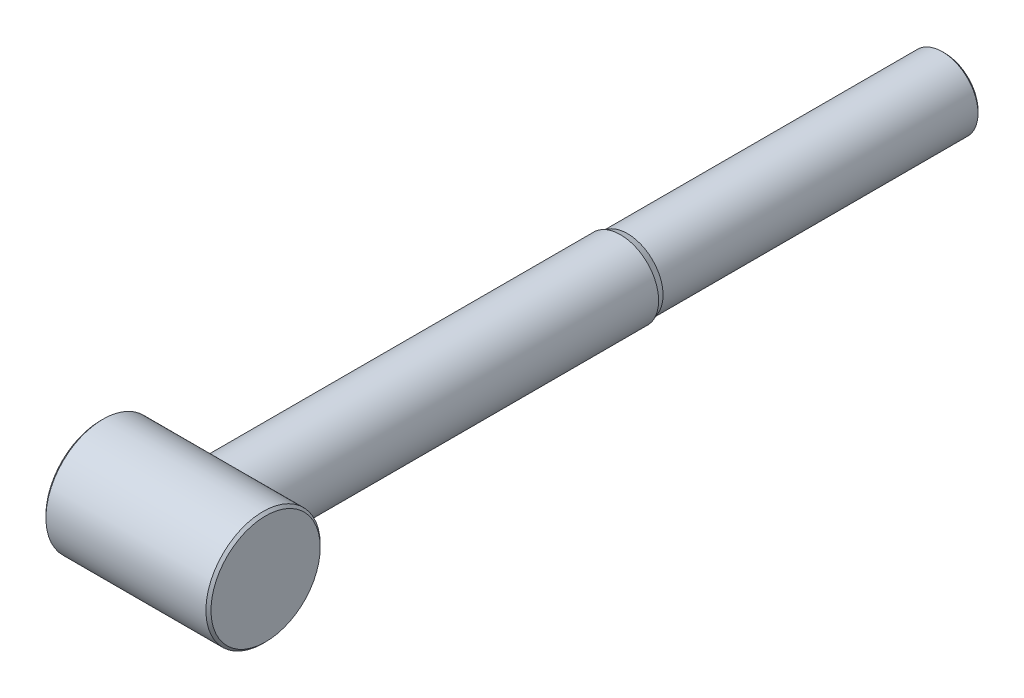
ISO-10303-21;
HEADER;
FILE_DESCRIPTION(('STEP AP214'),'2;1');
FILE_NAME('part.step','',(''),(''),'','','');
FILE_SCHEMA(('AUTOMOTIVE_DESIGN { 1 0 10303 214 1 1 1 1 }'));
ENDSEC;
DATA;
#1=APPLICATION_CONTEXT('core data for automotive mechanical design processes');
#2=APPLICATION_PROTOCOL_DEFINITION('international standard','automotive_design',2000,#1);
#3=PRODUCT_CONTEXT('',#1,'mechanical');
#4=PRODUCT('Part','Part','',(#3));
#5=PRODUCT_RELATED_PRODUCT_CATEGORY('part','',(#4));
#6=PRODUCT_DEFINITION_FORMATION('','',#4);
#7=PRODUCT_DEFINITION_CONTEXT('part definition',#1,'design');
#8=PRODUCT_DEFINITION('design','',#6,#7);
#9=PRODUCT_DEFINITION_SHAPE('','',#8);
#10=(LENGTH_UNIT() NAMED_UNIT(*) SI_UNIT(.MILLI.,.METRE.));
#11=(NAMED_UNIT(*) PLANE_ANGLE_UNIT() SI_UNIT($,.RADIAN.));
#12=(NAMED_UNIT(*) SI_UNIT($,.STERADIAN.) SOLID_ANGLE_UNIT());
#13=UNCERTAINTY_MEASURE_WITH_UNIT(LENGTH_MEASURE(1.E-05),#10,'distance_accuracy_value','');
#14=(GEOMETRIC_REPRESENTATION_CONTEXT(3) GLOBAL_UNCERTAINTY_ASSIGNED_CONTEXT((#13)) GLOBAL_UNIT_ASSIGNED_CONTEXT((#10,
#11,#12)) REPRESENTATION_CONTEXT('',''));
#15=CARTESIAN_POINT('',(0.,0.,0.));
#16=DIRECTION('',(0.,0.,1.));
#17=DIRECTION('',(1.,0.,0.));
#18=AXIS2_PLACEMENT_3D('',#15,#16,#17);
#19=CARTESIAN_POINT('',(0.,0.,-60.));
#20=DIRECTION('',(0.,0.,1.));
#21=DIRECTION('',(1.,0.,0.));
#22=AXIS2_PLACEMENT_3D('',#19,#20,#21);
#23=CYLINDRICAL_SURFACE('',#22,3.);
#24=CARTESIAN_POINT('',(0.,0.,-34.4505045161091));
#25=DIRECTION('',(0.,0.,-1.));
#26=DIRECTION('',(-1.,0.,0.));
#27=AXIS2_PLACEMENT_3D('',#24,#25,#26);
#28=CIRCLE('',#27,3.);
#29=CARTESIAN_POINT('',(-3.,0.,-34.4505045161091));
#30=VERTEX_POINT('',#29);
#31=EDGE_CURVE('E64',#30,#30,#28,.F.);
#32=ORIENTED_EDGE('',*,*,#31,.T.);
#33=EDGE_LOOP('',(#32));
#34=FACE_BOUND('',#33,.T.);
#35=CARTESIAN_POINT('',(3.,0.,-4.49999999999999));
#36=CARTESIAN_POINT('',(2.99999813426493,0.15072164959947,-4.49999851870945));
#37=CARTESIAN_POINT('',(2.98857832417678,0.301452176851334,-4.49236147696476));
#38=CARTESIAN_POINT('',(2.94360542507381,0.59810104158593,-4.46257035096117));
#39=CARTESIAN_POINT('',(2.91004182818988,0.744017059910981,-4.44040937470719));
#40=CARTESIAN_POINT('',(2.82283823203407,1.02631807461022,-4.38375708578349));
#41=CARTESIAN_POINT('',(2.76929223840315,1.16274420495288,-4.34932354201735));
#42=CARTESIAN_POINT('',(2.64440500668519,1.42412304054445,-4.27089210854984));
#43=CARTESIAN_POINT('',(2.57306118489946,1.54907407635533,-4.22689283031654));
#44=CARTESIAN_POINT('',(2.40801457838083,1.7959270197585,-4.1284099283604));
#45=CARTESIAN_POINT('',(2.31292820469136,1.91667044973221,-4.0733534604063));
#46=CARTESIAN_POINT('',(2.10640493121269,2.14159207551014,-3.95973469954022));
#47=CARTESIAN_POINT('',(1.99494460644394,2.24574608557946,-3.90116745629249));
#48=CARTESIAN_POINT('',(1.73842144719105,2.45133446337936,-3.7759239690936));
#49=CARTESIAN_POINT('',(1.59083151982669,2.54974779469906,-3.70942601877786));
#50=CARTESIAN_POINT('',(1.2774549338977,2.72025535595352,-3.58626221058086));
#51=CARTESIAN_POINT('',(1.11170039773947,2.79239510156523,-3.52957943938873));
#52=CARTESIAN_POINT('',(0.81493305980811,2.8901105250523,-3.44964399957303));
#53=CARTESIAN_POINT('',(0.687707320671581,2.92311670850673,-3.42146441836474));
#54=CARTESIAN_POINT('',(0.427883242905055,2.97225926681176,-3.37886954491533));
#55=CARTESIAN_POINT('',(0.295294576921709,2.9884247197938,-3.36443053119849));
#56=CARTESIAN_POINT('',(0.027787831704452,3.002870462104,-3.35154908408425));
#57=CARTESIAN_POINT('',(-0.107137535204394,3.00107764373871,-3.35317203825297));
#58=CARTESIAN_POINT('',(-0.374452460223818,2.97956372002451,-3.37229663237604));
#59=CARTESIAN_POINT('',(-0.506839772949758,2.95982742578818,-3.3898117247656));
#60=CARTESIAN_POINT('',(-0.759700576968738,2.90497491317742,-3.43690778941067));
#61=CARTESIAN_POINT('',(-0.880442004264519,2.87057567189679,-3.46592232325882));
#62=CARTESIAN_POINT('',(-1.11453553681584,2.78805177845537,-3.53264434237926));
#63=CARTESIAN_POINT('',(-1.22788519545557,2.73992260984511,-3.57035468734855));
#64=CARTESIAN_POINT('',(-1.46853809290249,2.62010728109711,-3.65946294623512));
#65=CARTESIAN_POINT('',(-1.59398985068898,2.54562078453565,-3.7120847662621));
#66=CARTESIAN_POINT('',(-1.83207509296433,2.3800344065443,-3.82037306584868));
#67=CARTESIAN_POINT('',(-1.94469248665353,2.28891403498575,-3.8760432405953));
#68=CARTESIAN_POINT('',(-2.17881381839246,2.06971747984492,-3.9981501565101));
#69=CARTESIAN_POINT('',(-2.29700107302078,1.93790907425758,-4.06432117082282));
#70=CARTESIAN_POINT('',(-2.50979474181109,1.65301199861739,-4.18827150996376));
#71=CARTESIAN_POINT('',(-2.60442321811428,1.49994344901489,-4.24605866471716));
#72=CARTESIAN_POINT('',(-2.75021657793366,1.20728674064532,-4.33718106135825));
#73=CARTESIAN_POINT('',(-2.80626504500823,1.07093646505801,-4.37308891748384));
#74=CARTESIAN_POINT('',(-2.89815738843823,0.789054065903077,-4.43261578545673));
#75=CARTESIAN_POINT('',(-2.93401834069837,0.643529818502434,-4.45624518191295));
#76=CARTESIAN_POINT('',(-2.98374174785695,0.346478179758459,-4.48913823235232));
#77=CARTESIAN_POINT('',(-2.99750919140738,0.194927717901251,-4.49833983691785));
#78=CARTESIAN_POINT('',(-3.00187063284332,-0.108662279084038,-4.50124672447714));
#79=CARTESIAN_POINT('',(-2.99246625073317,-0.260701779279965,-4.49495309078449));
#80=CARTESIAN_POINT('',(-2.95256391665706,-0.549683575806335,-4.46849384136411));
#81=CARTESIAN_POINT('',(-2.92359405336714,-0.686936167018711,-4.44933369585341));
#82=CARTESIAN_POINT('',(-2.84760647098074,-0.954174588641181,-4.39977673927253));
#83=CARTESIAN_POINT('',(-2.80058587360779,-1.08415925635699,-4.36937813620477));
#84=CARTESIAN_POINT('',(-2.6870215544325,-1.34199712569869,-4.29744528793742));
#85=CARTESIAN_POINT('',(-2.61946776887678,-1.46924427694594,-4.255348052037));
#86=CARTESIAN_POINT('',(-2.46835006508102,-1.71102453593713,-4.16402783417243));
#87=CARTESIAN_POINT('',(-2.38477625920336,-1.82554972230581,-4.11480045605826));
#88=CARTESIAN_POINT('',(-2.18908819776186,-2.0577816822297,-4.00431819980243));
#89=CARTESIAN_POINT('',(-2.07455060987986,-2.17312781352281,-3.94239235200639));
#90=CARTESIAN_POINT('',(-1.82833285507183,-2.38400952106241,-3.81856759628544));
#91=CARTESIAN_POINT('',(-1.69664094136691,-2.47953140493601,-3.75666873625294));
#92=CARTESIAN_POINT('',(-1.42928638082202,-2.6418716481687,-3.64409518457218));
#93=CARTESIAN_POINT('',(-1.29490194971418,-2.71043454162459,-3.59291395543388));
#94=CARTESIAN_POINT('',(-1.01419102142688,-2.82744320635816,-3.50158461394404));
#95=CARTESIAN_POINT('',(-0.867886592886366,-2.87592518617797,-3.46141668776782));
#96=CARTESIAN_POINT('',(-0.593153268925322,-2.94353765120496,-3.4039981228867));
#97=CARTESIAN_POINT('',(-0.466242284223142,-2.96637896084263,-3.38392497082229));
#98=CARTESIAN_POINT('',(-0.209140078984214,-2.99548809149845,-3.35819199607308));
#99=CARTESIAN_POINT('',(-0.0789525768548885,-3.00177391409198,-3.35251651835367));
#100=CARTESIAN_POINT('',(0.180964588651791,-2.99735881990096,-3.35646301911439));
#101=CARTESIAN_POINT('',(0.310693935366902,-2.98664784488398,-3.36609405556937));
#102=CARTESIAN_POINT('',(0.56601527947414,-2.94895499505287,-3.39915677908566));
#103=CARTESIAN_POINT('',(0.691601520980542,-2.9219514129043,-3.42260687689844));
#104=CARTESIAN_POINT('',(0.968566842735901,-2.8438953613818,-3.48790269152003));
#105=CARTESIAN_POINT('',(1.11790183368218,-2.78835207942162,-3.53298514180157));
#106=CARTESIAN_POINT('',(1.40322998693671,-2.65626862210843,-3.63333227844808));
#107=CARTESIAN_POINT('',(1.53920405087502,-2.57969896746294,-3.68861122446522));
#108=CARTESIAN_POINT('',(1.79892384494852,-2.40597141606592,-3.80425832897252));
#109=CARTESIAN_POINT('',(1.92240193767324,-2.3084641330428,-3.86470080799841));
#110=CARTESIAN_POINT('',(2.15297989667609,-2.09508703906085,-3.98442252534058));
#111=CARTESIAN_POINT('',(2.26007472522242,-1.97921160224442,-4.04370140099277));
#112=CARTESIAN_POINT('',(2.47008447510065,-1.71214106865832,-4.16448181195186));
#113=CARTESIAN_POINT('',(2.5701929232954,-1.55826365805385,-4.22508104882973));
#114=CARTESIAN_POINT('',(2.69899932827404,-1.31299166972122,-4.30505398282392));
#115=CARTESIAN_POINT('',(2.73837392455961,-1.22882978620485,-4.32988963193168));
#116=CARTESIAN_POINT('',(2.80946645928097,-1.05622318392366,-4.37519698031788));
#117=CARTESIAN_POINT('',(2.8411870865214,-0.967779982313747,-4.39567021179748));
#118=CARTESIAN_POINT('',(2.91169488938088,-0.737227179511889,-4.44149572508135));
#119=CARTESIAN_POINT('',(2.94465665075917,-0.59253846952761,-4.4632644493173));
#120=CARTESIAN_POINT('',(2.98880194924378,-0.29856705142419,-4.49251195251075));
#121=CARTESIAN_POINT('',(3.00000184798691,-0.149287880489566,-4.50000146719946));
#122=CARTESIAN_POINT('',(3.,0.,-4.49999999999999));
#123=B_SPLINE_CURVE_WITH_KNOTS('',3,(#35,#36,#37,#38,#39,#40,#41,#42,#43,#44,#45,#46,#47,#48,
#49,#50,#51,#52,#53,#54,#55,#56,#57,#58,#59,#60,#61,#62,#63,#64,#65,#66,#67,#68,#69,#70,#71,#72,
#73,#74,#75,#76,#77,#78,#79,#80,#81,#82,#83,#84,#85,#86,#87,#88,#89,#90,#91,#92,#93,#94,#95,#96,
#97,#98,#99,#100,#101,#102,#103,#104,#105,#106,#107,#108,#109,#110,#111,#112,#113,#114,#115,
#116,#117,#118,#119,#120,#121,#122),.UNSPECIFIED.,.T.,.F.,(4,2,2,2,2,2,2,2,2,2,2,2,2,2,2,2,2,2,
2,2,2,2,2,2,2,2,2,2,2,2,2,2,2,2,2,2,2,2,2,2,2,2,2,4),(0.,0.4515798397581,0.903374121523032,
1.35306922978535,1.8028296580108,2.29075543500835,2.77938617406478,3.34510024943974,
3.90982958168158,4.31150540514044,4.71248651768714,5.11510067603067,5.51805595895028,
5.90323293302503,6.28853675717405,6.75221362001097,7.21646555679872,7.78078431754915,
8.34457260461831,8.79786131554924,9.25076602724007,9.70561324951163,10.1604286730991,
10.583296271985,11.0062313271719,11.4547852025406,11.9036168242759,12.4234226422172,
12.9435862977342,13.419749029665,13.8950493997087,14.2848607203399,14.6742480050942,
15.0638658043661,15.4540038578839,15.9480991306608,16.4428907007672,16.9466886781651,
17.4506412596501,18.0269302733763,18.3150447812807,18.603057928026,19.0506787001148,
19.4979627985071),.UNSPECIFIED.);
#124=CARTESIAN_POINT('',(3.,0.,-4.49999999999999));
#125=VERTEX_POINT('',#124);
#126=EDGE_CURVE('E67',#125,#125,#123,.T.);
#127=ORIENTED_EDGE('',*,*,#126,.F.);
#128=EDGE_LOOP('',(#127));
#129=FACE_BOUND('',#128,.T.);
#130=ADVANCED_FACE('F38',(#34,#129),#23,.T.);
#131=CARTESIAN_POINT('',(6.5,0.,0.));
#132=DIRECTION('',(-1.,0.,0.));
#133=DIRECTION('',(0.,0.,1.));
#134=AXIS2_PLACEMENT_3D('',#131,#132,#133);
#135=CYLINDRICAL_SURFACE('',#134,4.5);
#136=CARTESIAN_POINT('',(-6.29999999999997,0.,0.));
#137=DIRECTION('',(1.,0.,0.));
#138=DIRECTION('',(0.,0.,-1.));
#139=AXIS2_PLACEMENT_3D('',#136,#137,#138);
#140=CIRCLE('',#139,4.5);
#141=CARTESIAN_POINT('',(-6.29999999999997,0.,-4.5));
#142=VERTEX_POINT('',#141);
#143=EDGE_CURVE('E58',#142,#142,#140,.T.);
#144=ORIENTED_EDGE('',*,*,#143,.T.);
#145=EDGE_LOOP('',(#144));
#146=FACE_BOUND('',#145,.T.);
#147=CARTESIAN_POINT('',(6.30000000000003,0.,0.));
#148=DIRECTION('',(1.,0.,0.));
#149=DIRECTION('',(0.,0.,-1.));
#150=AXIS2_PLACEMENT_3D('',#147,#148,#149);
#151=CIRCLE('',#150,4.5);
#152=CARTESIAN_POINT('',(6.30000000000003,0.,-4.5));
#153=VERTEX_POINT('',#152);
#154=EDGE_CURVE('E61',#153,#153,#151,.F.);
#155=ORIENTED_EDGE('',*,*,#154,.T.);
#156=EDGE_LOOP('',(#155));
#157=FACE_BOUND('',#156,.T.);
#158=ORIENTED_EDGE('',*,*,#126,.T.);
#159=EDGE_LOOP('',(#158));
#160=FACE_BOUND('',#159,.T.);
#161=ADVANCED_FACE('F76',(#146,#157,#160),#135,.T.);
#162=CARTESIAN_POINT('',(6.5,0.,0.));
#163=DIRECTION('',(1.,0.,0.));
#164=DIRECTION('',(0.,0.,-1.));
#165=AXIS2_PLACEMENT_3D('',#162,#163,#164);
#166=PLANE('',#165);
#167=CARTESIAN_POINT('',(6.5,0.,0.));
#168=DIRECTION('',(1.,0.,0.));
#169=DIRECTION('',(0.,0.,-1.));
#170=AXIS2_PLACEMENT_3D('',#167,#168,#169);
#171=CIRCLE('',#170,4.30000000000004);
#172=CARTESIAN_POINT('',(6.5,0.,-4.30000000000004));
#173=VERTEX_POINT('',#172);
#174=EDGE_CURVE('E49',#173,#173,#171,.T.);
#175=ORIENTED_EDGE('',*,*,#174,.T.);
#176=EDGE_LOOP('',(#175));
#177=FACE_BOUND('',#176,.T.);
#178=ADVANCED_FACE('F87',(#177),#166,.T.);
#179=CARTESIAN_POINT('',(-6.5,0.,0.));
#180=DIRECTION('',(1.,0.,0.));
#181=DIRECTION('',(0.,0.,-1.));
#182=AXIS2_PLACEMENT_3D('',#179,#180,#181);
#183=PLANE('',#182);
#184=CARTESIAN_POINT('',(-6.5,0.,0.));
#185=DIRECTION('',(1.,0.,0.));
#186=DIRECTION('',(0.,0.,-1.));
#187=AXIS2_PLACEMENT_3D('',#184,#185,#186);
#188=CIRCLE('',#187,4.29999999999997);
#189=CARTESIAN_POINT('',(-6.5,0.,-4.29999999999997));
#190=VERTEX_POINT('',#189);
#191=EDGE_CURVE('E53',#190,#190,#188,.F.);
#192=ORIENTED_EDGE('',*,*,#191,.T.);
#193=EDGE_LOOP('',(#192));
#194=FACE_BOUND('',#193,.T.);
#195=ADVANCED_FACE('F89',(#194),#183,.F.);
#196=CARTESIAN_POINT('',(0.,0.,-35.));
#197=DIRECTION('',(0.,0.,-1.));
#198=DIRECTION('',(-1.,0.,0.));
#199=AXIS2_PLACEMENT_3D('',#196,#197,#198);
#200=CYLINDRICAL_SURFACE('',#199,2.8);
#201=CARTESIAN_POINT('',(0.,0.,-59.8));
#202=DIRECTION('',(0.,0.,1.));
#203=DIRECTION('',(1.,0.,0.));
#204=AXIS2_PLACEMENT_3D('',#201,#202,#203);
#205=CIRCLE('',#204,2.8);
#206=CARTESIAN_POINT('',(2.8,0.,-59.8));
#207=VERTEX_POINT('',#206);
#208=EDGE_CURVE('E11',#207,#207,#205,.T.);
#209=ORIENTED_EDGE('',*,*,#208,.T.);
#210=EDGE_LOOP('',(#209));
#211=FACE_BOUND('',#210,.T.);
#212=CARTESIAN_POINT('',(0.,0.,-35.));
#213=DIRECTION('',(0.,0.,-1.));
#214=DIRECTION('',(-1.,0.,0.));
#215=AXIS2_PLACEMENT_3D('',#212,#213,#214);
#216=CIRCLE('',#215,2.8);
#217=CARTESIAN_POINT('',(-2.8,0.,-35.));
#218=VERTEX_POINT('',#217);
#219=EDGE_CURVE('E75',#218,#218,#216,.T.);
#220=ORIENTED_EDGE('',*,*,#219,.T.);
#221=EDGE_LOOP('',(#220));
#222=FACE_BOUND('',#221,.T.);
#223=ADVANCED_FACE('F92',(#211,#222),#200,.T.);
#224=CARTESIAN_POINT('',(0.,0.,-60.));
#225=DIRECTION('',(0.,0.,1.));
#226=DIRECTION('',(1.,0.,0.));
#227=AXIS2_PLACEMENT_3D('',#224,#225,#226);
#228=PLANE('',#227);
#229=CARTESIAN_POINT('',(0.,0.,-60.));
#230=DIRECTION('',(0.,0.,1.));
#231=DIRECTION('',(1.,0.,0.));
#232=AXIS2_PLACEMENT_3D('',#229,#230,#231);
#233=CIRCLE('',#232,2.6);
#234=CARTESIAN_POINT('',(2.6,0.,-60.));
#235=VERTEX_POINT('',#234);
#236=EDGE_CURVE('E45',#235,#235,#233,.F.);
#237=ORIENTED_EDGE('',*,*,#236,.T.);
#238=EDGE_LOOP('',(#237));
#239=FACE_BOUND('',#238,.T.);
#240=ADVANCED_FACE('F85',(#239),#228,.F.);
#241=CARTESIAN_POINT('',(0.,0.,-35.));
#242=DIRECTION('',(0.,0.,1.));
#243=DIRECTION('',(1.,0.,0.));
#244=AXIS2_PLACEMENT_3D('',#241,#242,#243);
#245=CONICAL_SURFACE('',#244,2.8,0.349065850398858);
#246=ORIENTED_EDGE('',*,*,#31,.F.);
#247=EDGE_LOOP('',(#246));
#248=FACE_BOUND('',#247,.T.);
#249=ORIENTED_EDGE('',*,*,#219,.F.);
#250=EDGE_LOOP('',(#249));
#251=FACE_BOUND('',#250,.T.);
#252=ADVANCED_FACE('F103',(#248,#251),#245,.T.);
#253=CARTESIAN_POINT('',(-6.29999999999997,0.,0.));
#254=DIRECTION('',(1.,0.,0.));
#255=DIRECTION('',(0.,0.,-1.));
#256=AXIS2_PLACEMENT_3D('',#253,#254,#255);
#257=CONICAL_SURFACE('',#256,4.5,0.785398163397457);
#258=CARTESIAN_POINT('',(-6.5,0.,-4.29999999999997));
#259=CARTESIAN_POINT('',(-6.49791666666667,0.,-4.3020833333333));
#260=CARTESIAN_POINT('',(-6.49583333333333,0.,-4.30416666666664));
#261=CARTESIAN_POINT('',(-6.49166666666667,0.,-4.3083333333333));
#262=CARTESIAN_POINT('',(-6.48958333333333,0.,-4.31041666666664));
#263=CARTESIAN_POINT('',(-6.48541666666666,0.,-4.3145833333333));
#264=CARTESIAN_POINT('',(-6.48333333333333,0.,-4.31666666666664));
#265=CARTESIAN_POINT('',(-6.47916666666666,0.,-4.32083333333331));
#266=CARTESIAN_POINT('',(-6.47708333333333,0.,-4.32291666666664));
#267=CARTESIAN_POINT('',(-6.47291666666666,0.,-4.32708333333331));
#268=CARTESIAN_POINT('',(-6.47083333333333,0.,-4.32916666666664));
#269=CARTESIAN_POINT('',(-6.46666666666666,0.,-4.33333333333331));
#270=CARTESIAN_POINT('',(-6.46458333333333,0.,-4.33541666666664));
#271=CARTESIAN_POINT('',(-6.46041666666666,0.,-4.33958333333331));
#272=CARTESIAN_POINT('',(-6.45833333333333,0.,-4.34166666666664));
#273=CARTESIAN_POINT('',(-6.45416666666666,0.,-4.34583333333331));
#274=CARTESIAN_POINT('',(-6.45208333333333,0.,-4.34791666666664));
#275=CARTESIAN_POINT('',(-6.44791666666666,0.,-4.35208333333331));
#276=CARTESIAN_POINT('',(-6.44583333333333,0.,-4.35416666666664));
#277=CARTESIAN_POINT('',(-6.44166666666666,0.,-4.35833333333331));
#278=CARTESIAN_POINT('',(-6.43958333333333,0.,-4.36041666666664));
#279=CARTESIAN_POINT('',(-6.43541666666666,0.,-4.36458333333331));
#280=CARTESIAN_POINT('',(-6.43333333333332,0.,-4.36666666666665));
#281=CARTESIAN_POINT('',(-6.42916666666666,0.,-4.37083333333331));
#282=CARTESIAN_POINT('',(-6.42708333333332,0.,-4.37291666666665));
#283=CARTESIAN_POINT('',(-6.42291666666666,0.,-4.37708333333331));
#284=CARTESIAN_POINT('',(-6.42083333333332,0.,-4.37916666666665));
#285=CARTESIAN_POINT('',(-6.41666666666666,0.,-4.38333333333332));
#286=CARTESIAN_POINT('',(-6.41458333333332,0.,-4.38541666666665));
#287=CARTESIAN_POINT('',(-6.41041666666665,0.,-4.38958333333332));
#288=CARTESIAN_POINT('',(-6.40833333333332,0.,-4.39166666666665));
#289=CARTESIAN_POINT('',(-6.40416666666665,0.,-4.39583333333332));
#290=CARTESIAN_POINT('',(-6.40208333333332,0.,-4.39791666666665));
#291=CARTESIAN_POINT('',(-6.39791666666665,0.,-4.40208333333332));
#292=CARTESIAN_POINT('',(-6.39583333333332,0.,-4.40416666666665));
#293=CARTESIAN_POINT('',(-6.39166666666665,0.,-4.40833333333332));
#294=CARTESIAN_POINT('',(-6.38958333333332,0.,-4.41041666666665));
#295=CARTESIAN_POINT('',(-6.38541666666665,0.,-4.41458333333332));
#296=CARTESIAN_POINT('',(-6.38333333333332,0.,-4.41666666666665));
#297=CARTESIAN_POINT('',(-6.37916666666665,0.,-4.42083333333332));
#298=CARTESIAN_POINT('',(-6.37708333333332,0.,-4.42291666666665));
#299=CARTESIAN_POINT('',(-6.37291666666665,0.,-4.42708333333332));
#300=CARTESIAN_POINT('',(-6.37083333333332,0.,-4.42916666666665));
#301=CARTESIAN_POINT('',(-6.36666666666665,0.,-4.43333333333332));
#302=CARTESIAN_POINT('',(-6.36458333333332,0.,-4.43541666666666));
#303=CARTESIAN_POINT('',(-6.36041666666665,0.,-4.43958333333332));
#304=CARTESIAN_POINT('',(-6.35833333333331,0.,-4.44166666666666));
#305=CARTESIAN_POINT('',(-6.35416666666665,0.,-4.44583333333332));
#306=CARTESIAN_POINT('',(-6.35208333333331,0.,-4.44791666666666));
#307=CARTESIAN_POINT('',(-6.34791666666665,0.,-4.45208333333333));
#308=CARTESIAN_POINT('',(-6.34583333333331,0.,-4.45416666666666));
#309=CARTESIAN_POINT('',(-6.34166666666665,0.,-4.45833333333333));
#310=CARTESIAN_POINT('',(-6.33958333333331,0.,-4.46041666666666));
#311=CARTESIAN_POINT('',(-6.33541666666664,0.,-4.46458333333333));
#312=CARTESIAN_POINT('',(-6.33333333333331,0.,-4.46666666666666));
#313=CARTESIAN_POINT('',(-6.32916666666664,0.,-4.47083333333333));
#314=CARTESIAN_POINT('',(-6.32708333333331,0.,-4.47291666666666));
#315=CARTESIAN_POINT('',(-6.32291666666664,0.,-4.47708333333333));
#316=CARTESIAN_POINT('',(-6.32083333333331,0.,-4.47916666666666));
#317=CARTESIAN_POINT('',(-6.31666666666664,0.,-4.48333333333333));
#318=CARTESIAN_POINT('',(-6.31458333333331,0.,-4.48541666666666));
#319=CARTESIAN_POINT('',(-6.31041666666664,0.,-4.48958333333333));
#320=CARTESIAN_POINT('',(-6.30833333333331,0.,-4.49166666666666));
#321=CARTESIAN_POINT('',(-6.30416666666664,0.,-4.49583333333333));
#322=CARTESIAN_POINT('',(-6.30208333333331,0.,-4.49791666666667));
#323=CARTESIAN_POINT('',(-6.29999999999997,0.,-4.5));
#324=B_SPLINE_CURVE_WITH_KNOTS('',3,(#258,#259,#260,#261,#262,#263,#264,#265,#266,#267,#268,
#269,#270,#271,#272,#273,#274,#275,#276,#277,#278,#279,#280,#281,#282,#283,#284,#285,#286,#287,
#288,#289,#290,#291,#292,#293,#294,#295,#296,#297,#298,#299,#300,#301,#302,#303,#304,#305,#306,
#307,#308,#309,#310,#311,#312,#313,#314,#315,#316,#317,#318,#319,#320,#321,#322,#323),
.UNSPECIFIED.,.F.,.F.,(4,2,2,2,2,2,2,2,2,2,2,2,2,2,2,2,2,2,2,2,2,2,2,2,2,2,2,2,2,2,2,2,4),(0.,
0.00883883476483271,0.017677669529666,0.0265165042944994,0.0353553390593327,0.0441941738241654,
0.0530330085889987,0.061871843353832,0.0707106781186654,0.0795495128834975,0.0883883476483308,
0.0972271824131641,0.106066017177997,0.11490485194283,0.123743686707663,0.132582521472497,
0.141421356237329,0.150260191002162,0.159099025766996,0.167937860531829,0.176776695296662,
0.185615530061495,0.194454364826328,0.203293199591162,0.212132034355995,0.220970869120827,
0.22980970388566,0.238648538650494,0.247487373415327,0.25632620818016,0.265165042944993,
0.274003877709826,0.282842712474659),.UNSPECIFIED.);
#325=EDGE_CURVE('BSEAM99',#190,#142,#324,.T.);
#326=ORIENTED_EDGE('',*,*,#191,.F.);
#327=ORIENTED_EDGE('',*,*,#143,.F.);
#328=ORIENTED_EDGE('',*,*,#325,.T.);
#329=ORIENTED_EDGE('',*,*,#325,.F.);
#330=EDGE_LOOP('',(#326,#328,#327,#329));
#331=FACE_BOUND('',#330,.T.);
#332=ADVANCED_FACE('F99',(#331),#257,.T.);
#333=CARTESIAN_POINT('',(6.5,0.,0.));
#334=DIRECTION('',(-1.,0.,0.));
#335=DIRECTION('',(0.,0.,1.));
#336=AXIS2_PLACEMENT_3D('',#333,#334,#335);
#337=CONICAL_SURFACE('',#336,4.30000000000004,0.785398163397422);
#338=ORIENTED_EDGE('',*,*,#154,.F.);
#339=EDGE_LOOP('',(#338));
#340=FACE_BOUND('',#339,.T.);
#341=ORIENTED_EDGE('',*,*,#174,.F.);
#342=EDGE_LOOP('',(#341));
#343=FACE_BOUND('',#342,.T.);
#344=ADVANCED_FACE('F102',(#340,#343),#337,.T.);
#345=CARTESIAN_POINT('',(0.,0.,-60.));
#346=DIRECTION('',(0.,0.,1.));
#347=DIRECTION('',(1.,0.,0.));
#348=AXIS2_PLACEMENT_3D('',#345,#346,#347);
#349=CONICAL_SURFACE('',#348,2.6,0.78539816339744);
#350=ORIENTED_EDGE('',*,*,#208,.F.);
#351=EDGE_LOOP('',(#350));
#352=FACE_BOUND('',#351,.T.);
#353=ORIENTED_EDGE('',*,*,#236,.F.);
#354=EDGE_LOOP('',(#353));
#355=FACE_BOUND('',#354,.T.);
#356=ADVANCED_FACE('F40',(#352,#355),#349,.T.);
#357=CLOSED_SHELL('',(#130,#161,#178,#195,#223,#240,#252,#332,#344,#356));
#358=MANIFOLD_SOLID_BREP('B2',#357);
#359=ADVANCED_BREP_SHAPE_REPRESENTATION('',(#18,#358),#14);
#360=SHAPE_DEFINITION_REPRESENTATION(#9,#359);
ENDSEC;
END-ISO-10303-21;
